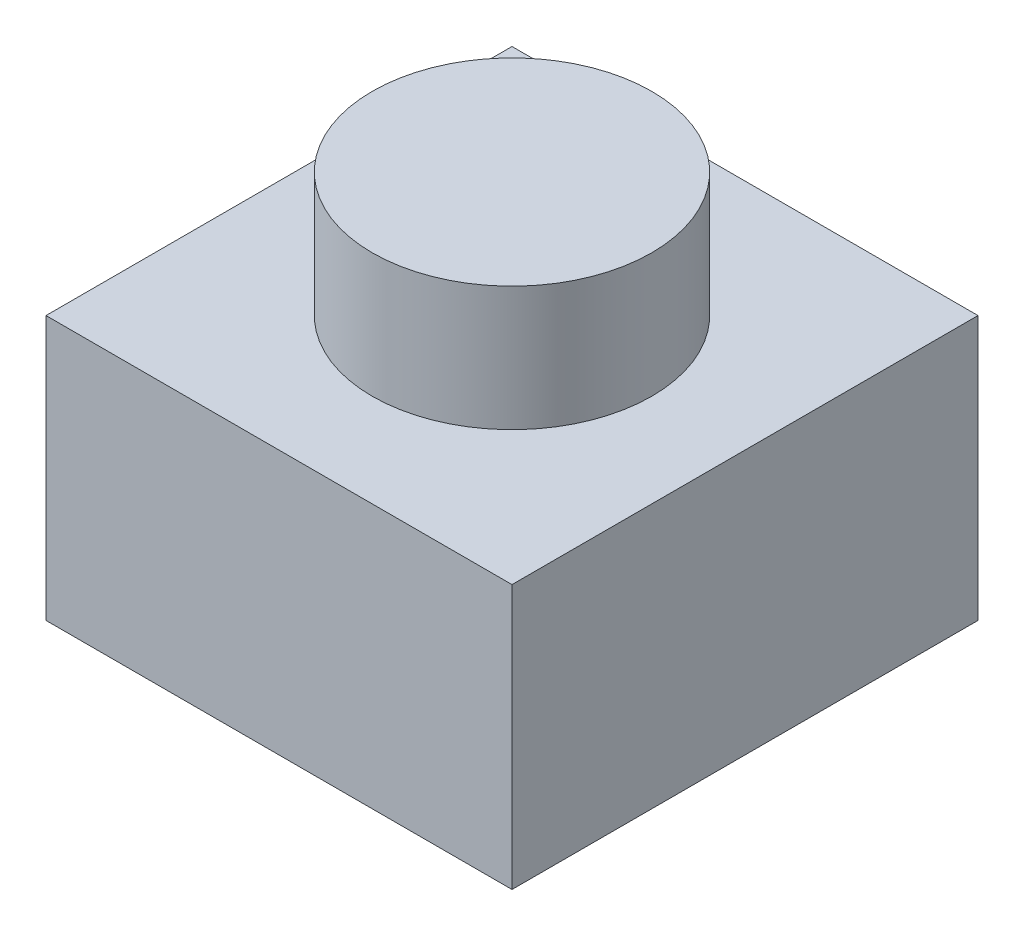
ISO-10303-21;
HEADER;
FILE_DESCRIPTION(('STEP AP214'),'2;1');
FILE_NAME('part.step','',(''),(''),'','','');
FILE_SCHEMA(('AUTOMOTIVE_DESIGN { 1 0 10303 214 1 1 1 1 }'));
ENDSEC;
DATA;
#1=APPLICATION_CONTEXT('core data for automotive mechanical design processes');
#2=APPLICATION_PROTOCOL_DEFINITION('international standard','automotive_design',2000,#1);
#3=PRODUCT_CONTEXT('',#1,'mechanical');
#4=PRODUCT('Part','Part','',(#3));
#5=PRODUCT_RELATED_PRODUCT_CATEGORY('part','',(#4));
#6=PRODUCT_DEFINITION_FORMATION('','',#4);
#7=PRODUCT_DEFINITION_CONTEXT('part definition',#1,'design');
#8=PRODUCT_DEFINITION('design','',#6,#7);
#9=PRODUCT_DEFINITION_SHAPE('','',#8);
#10=(LENGTH_UNIT() NAMED_UNIT(*) SI_UNIT(.MILLI.,.METRE.));
#11=(NAMED_UNIT(*) PLANE_ANGLE_UNIT() SI_UNIT($,.RADIAN.));
#12=(NAMED_UNIT(*) SI_UNIT($,.STERADIAN.) SOLID_ANGLE_UNIT());
#13=UNCERTAINTY_MEASURE_WITH_UNIT(LENGTH_MEASURE(1.E-05),#10,'distance_accuracy_value','');
#14=(GEOMETRIC_REPRESENTATION_CONTEXT(3) GLOBAL_UNCERTAINTY_ASSIGNED_CONTEXT((#13)) GLOBAL_UNIT_ASSIGNED_CONTEXT((#10,
#11,#12)) REPRESENTATION_CONTEXT('',''));
#15=CARTESIAN_POINT('',(0.,0.,0.));
#16=DIRECTION('',(0.,0.,1.));
#17=DIRECTION('',(1.,0.,0.));
#18=AXIS2_PLACEMENT_3D('',#15,#16,#17);
#19=CARTESIAN_POINT('',(0.,3.4,0.));
#20=DIRECTION('',(1.,0.,0.));
#21=DIRECTION('',(0.,0.,-1.));
#22=AXIS2_PLACEMENT_3D('',#19,#20,#21);
#23=PLANE('',#22);
#24=DIRECTION('',(0.,0.,1.));
#25=VECTOR('',#24,1.);
#26=CARTESIAN_POINT('',(0.,0.,0.));
#27=LINE('',#26,#25);
#28=CARTESIAN_POINT('',(0.,0.,-6.));
#29=VERTEX_POINT('',#28);
#30=CARTESIAN_POINT('',(0.,0.,0.));
#31=VERTEX_POINT('',#30);
#32=EDGE_CURVE('E103',#29,#31,#27,.T.);
#33=ORIENTED_EDGE('',*,*,#32,.T.);
#34=DIRECTION('',(0.,-1.,0.));
#35=VECTOR('',#34,1.);
#36=CARTESIAN_POINT('',(0.,3.4,0.));
#37=LINE('',#36,#35);
#38=CARTESIAN_POINT('',(0.,3.4,0.));
#39=VERTEX_POINT('',#38);
#40=EDGE_CURVE('E40',#39,#31,#37,.T.);
#41=ORIENTED_EDGE('',*,*,#40,.F.);
#42=DIRECTION('',(0.,0.,1.));
#43=VECTOR('',#42,1.);
#44=CARTESIAN_POINT('',(0.,3.4,0.));
#45=LINE('',#44,#43);
#46=CARTESIAN_POINT('',(0.,3.4,-6.));
#47=VERTEX_POINT('',#46);
#48=EDGE_CURVE('E90',#47,#39,#45,.T.);
#49=ORIENTED_EDGE('',*,*,#48,.F.);
#50=DIRECTION('',(0.,-1.,0.));
#51=VECTOR('',#50,1.);
#52=CARTESIAN_POINT('',(0.,3.4,-6.));
#53=LINE('',#52,#51);
#54=EDGE_CURVE('E99',#47,#29,#53,.T.);
#55=ORIENTED_EDGE('',*,*,#54,.T.);
#56=EDGE_LOOP('',(#33,#41,#49,#55));
#57=FACE_BOUND('',#56,.T.);
#58=ADVANCED_FACE('F37',(#57),#23,.F.);
#59=CARTESIAN_POINT('',(0.,3.4,0.));
#60=DIRECTION('',(0.,0.,-1.));
#61=DIRECTION('',(-1.,0.,0.));
#62=AXIS2_PLACEMENT_3D('',#59,#60,#61);
#63=PLANE('',#62);
#64=DIRECTION('',(1.,0.,0.));
#65=VECTOR('',#64,1.);
#66=CARTESIAN_POINT('',(0.,0.,0.));
#67=LINE('',#66,#65);
#68=CARTESIAN_POINT('',(6.00000000000001,0.,0.));
#69=VERTEX_POINT('',#68);
#70=EDGE_CURVE('E95',#31,#69,#67,.T.);
#71=ORIENTED_EDGE('',*,*,#70,.T.);
#72=DIRECTION('',(0.,-1.,0.));
#73=VECTOR('',#72,1.);
#74=CARTESIAN_POINT('',(6.00000000000001,3.4,0.));
#75=LINE('',#74,#73);
#76=CARTESIAN_POINT('',(6.00000000000001,3.4,0.));
#77=VERTEX_POINT('',#76);
#78=EDGE_CURVE('E93',#77,#69,#75,.T.);
#79=ORIENTED_EDGE('',*,*,#78,.F.);
#80=DIRECTION('',(1.,0.,0.));
#81=VECTOR('',#80,1.);
#82=CARTESIAN_POINT('',(0.,3.4,0.));
#83=LINE('',#82,#81);
#84=EDGE_CURVE('E85',#39,#77,#83,.T.);
#85=ORIENTED_EDGE('',*,*,#84,.F.);
#86=ORIENTED_EDGE('',*,*,#40,.T.);
#87=EDGE_LOOP('',(#71,#79,#85,#86));
#88=FACE_BOUND('',#87,.T.);
#89=ADVANCED_FACE('F94',(#88),#63,.F.);
#90=CARTESIAN_POINT('',(6.00000000000001,3.4,0.));
#91=DIRECTION('',(-1.,0.,0.));
#92=DIRECTION('',(0.,0.,1.));
#93=AXIS2_PLACEMENT_3D('',#90,#91,#92);
#94=PLANE('',#93);
#95=DIRECTION('',(0.,0.,-1.));
#96=VECTOR('',#95,1.);
#97=CARTESIAN_POINT('',(6.00000000000001,0.,0.));
#98=LINE('',#97,#96);
#99=CARTESIAN_POINT('',(6.00000000000001,0.,-6.));
#100=VERTEX_POINT('',#99);
#101=EDGE_CURVE('E71',#69,#100,#98,.T.);
#102=ORIENTED_EDGE('',*,*,#101,.T.);
#103=DIRECTION('',(0.,-1.,0.));
#104=VECTOR('',#103,1.);
#105=CARTESIAN_POINT('',(6.00000000000001,3.4,-6.));
#106=LINE('',#105,#104);
#107=CARTESIAN_POINT('',(6.00000000000001,3.4,-6.));
#108=VERTEX_POINT('',#107);
#109=EDGE_CURVE('E96',#108,#100,#106,.T.);
#110=ORIENTED_EDGE('',*,*,#109,.F.);
#111=DIRECTION('',(0.,0.,-1.));
#112=VECTOR('',#111,1.);
#113=CARTESIAN_POINT('',(6.00000000000001,3.4,0.));
#114=LINE('',#113,#112);
#115=EDGE_CURVE('E88',#77,#108,#114,.T.);
#116=ORIENTED_EDGE('',*,*,#115,.F.);
#117=ORIENTED_EDGE('',*,*,#78,.T.);
#118=EDGE_LOOP('',(#102,#110,#116,#117));
#119=FACE_BOUND('',#118,.T.);
#120=ADVANCED_FACE('F97',(#119),#94,.F.);
#121=CARTESIAN_POINT('',(0.,3.4,-6.));
#122=DIRECTION('',(0.,0.,1.));
#123=DIRECTION('',(1.,0.,0.));
#124=AXIS2_PLACEMENT_3D('',#121,#122,#123);
#125=PLANE('',#124);
#126=DIRECTION('',(-1.,0.,0.));
#127=VECTOR('',#126,1.);
#128=CARTESIAN_POINT('',(0.,0.,-6.));
#129=LINE('',#128,#127);
#130=EDGE_CURVE('E77',#100,#29,#129,.T.);
#131=ORIENTED_EDGE('',*,*,#130,.T.);
#132=ORIENTED_EDGE('',*,*,#54,.F.);
#133=DIRECTION('',(-1.,0.,0.));
#134=VECTOR('',#133,1.);
#135=CARTESIAN_POINT('',(0.,3.4,-6.));
#136=LINE('',#135,#134);
#137=EDGE_CURVE('E54',#108,#47,#136,.T.);
#138=ORIENTED_EDGE('',*,*,#137,.F.);
#139=ORIENTED_EDGE('',*,*,#109,.T.);
#140=EDGE_LOOP('',(#131,#132,#138,#139));
#141=FACE_BOUND('',#140,.T.);
#142=ADVANCED_FACE('F111',(#141),#125,.F.);
#143=CARTESIAN_POINT('',(0.,3.4,0.));
#144=DIRECTION('',(0.,-1.,0.));
#145=DIRECTION('',(0.,0.,-1.));
#146=AXIS2_PLACEMENT_3D('',#143,#144,#145);
#147=PLANE('',#146);
#148=CARTESIAN_POINT('',(3.,3.4,-3.));
#149=DIRECTION('',(0.,1.,0.));
#150=DIRECTION('',(0.,0.,1.));
#151=AXIS2_PLACEMENT_3D('',#148,#149,#150);
#152=CIRCLE('',#151,1.8);
#153=CARTESIAN_POINT('',(3.,3.4,-1.2));
#154=VERTEX_POINT('',#153);
#155=EDGE_CURVE('E11',#154,#154,#152,.T.);
#156=ORIENTED_EDGE('',*,*,#155,.F.);
#157=EDGE_LOOP('',(#156));
#158=FACE_BOUND('',#157,.T.);
#159=ORIENTED_EDGE('',*,*,#48,.T.);
#160=ORIENTED_EDGE('',*,*,#84,.T.);
#161=ORIENTED_EDGE('',*,*,#115,.T.);
#162=ORIENTED_EDGE('',*,*,#137,.T.);
#163=EDGE_LOOP('',(#159,#160,#161,#162));
#164=FACE_BOUND('',#163,.T.);
#165=ADVANCED_FACE('F86',(#158,#164),#147,.F.);
#166=CARTESIAN_POINT('',(0.,0.,0.));
#167=DIRECTION('',(0.,-1.,0.));
#168=DIRECTION('',(0.,0.,-1.));
#169=AXIS2_PLACEMENT_3D('',#166,#167,#168);
#170=PLANE('',#169);
#171=ORIENTED_EDGE('',*,*,#32,.F.);
#172=ORIENTED_EDGE('',*,*,#130,.F.);
#173=ORIENTED_EDGE('',*,*,#101,.F.);
#174=ORIENTED_EDGE('',*,*,#70,.F.);
#175=EDGE_LOOP('',(#171,#172,#173,#174));
#176=FACE_BOUND('',#175,.T.);
#177=ADVANCED_FACE('F114',(#176),#170,.T.);
#178=CARTESIAN_POINT('',(3.,5.,-3.));
#179=DIRECTION('',(0.,-1.,0.));
#180=DIRECTION('',(0.,0.,-1.));
#181=AXIS2_PLACEMENT_3D('',#178,#179,#180);
#182=CYLINDRICAL_SURFACE('',#181,1.8);
#183=CARTESIAN_POINT('',(3.,5.,-3.));
#184=DIRECTION('',(0.,1.,0.));
#185=DIRECTION('',(0.,0.,1.));
#186=AXIS2_PLACEMENT_3D('',#183,#184,#185);
#187=CIRCLE('',#186,1.8);
#188=CARTESIAN_POINT('',(3.,5.,-1.2));
#189=VERTEX_POINT('',#188);
#190=EDGE_CURVE('E106',#189,#189,#187,.T.);
#191=ORIENTED_EDGE('',*,*,#190,.F.);
#192=EDGE_LOOP('',(#191));
#193=FACE_BOUND('',#192,.T.);
#194=ORIENTED_EDGE('',*,*,#155,.T.);
#195=EDGE_LOOP('',(#194));
#196=FACE_BOUND('',#195,.T.);
#197=ADVANCED_FACE('F122',(#193,#196),#182,.T.);
#198=CARTESIAN_POINT('',(3.,5.,-3.));
#199=DIRECTION('',(0.,1.,0.));
#200=DIRECTION('',(0.,0.,1.));
#201=AXIS2_PLACEMENT_3D('',#198,#199,#200);
#202=PLANE('',#201);
#203=ORIENTED_EDGE('',*,*,#190,.T.);
#204=EDGE_LOOP('',(#203));
#205=FACE_BOUND('',#204,.T.);
#206=ADVANCED_FACE('F120',(#205),#202,.T.);
#207=CLOSED_SHELL('',(#58,#89,#120,#142,#165,#177,#197,#206));
#208=MANIFOLD_SOLID_BREP('B2',#207);
#209=ADVANCED_BREP_SHAPE_REPRESENTATION('',(#18,#208),#14);
#210=SHAPE_DEFINITION_REPRESENTATION(#9,#209);
ENDSEC;
END-ISO-10303-21;
